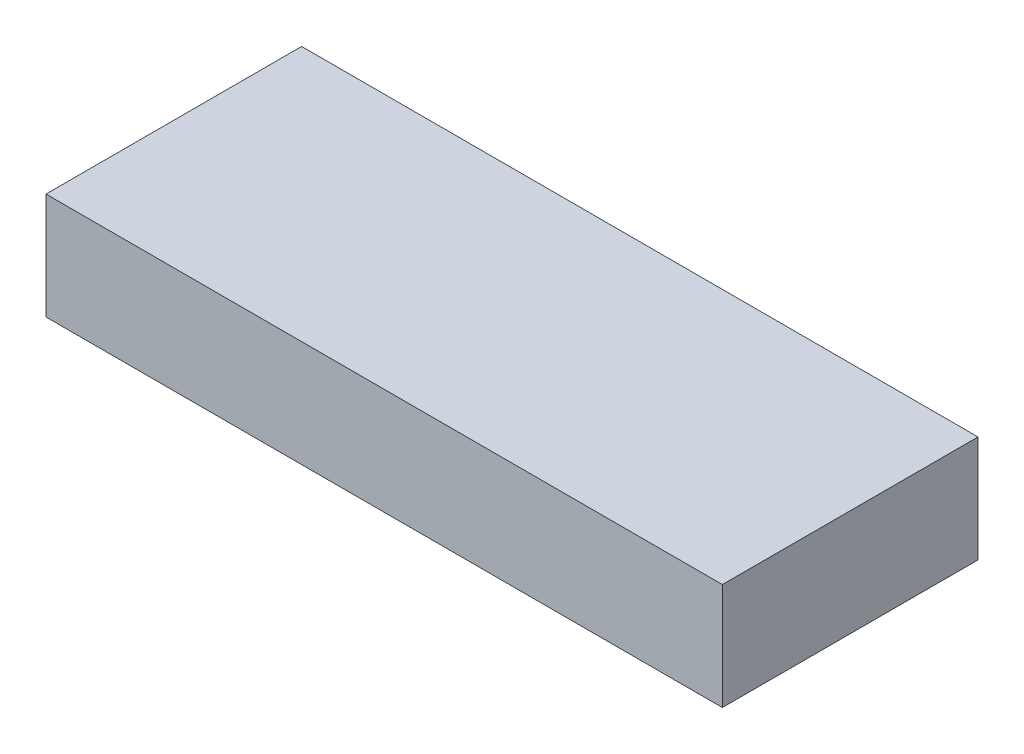
ISO-10303-21;
HEADER;
FILE_DESCRIPTION(('STEP AP214'),'2;1');
FILE_NAME('part.step','',(''),(''),'','','');
FILE_SCHEMA(('AUTOMOTIVE_DESIGN { 1 0 10303 214 1 1 1 1 }'));
ENDSEC;
DATA;
#1=APPLICATION_CONTEXT('core data for automotive mechanical design processes');
#2=APPLICATION_PROTOCOL_DEFINITION('international standard','automotive_design',2000,#1);
#3=PRODUCT_CONTEXT('',#1,'mechanical');
#4=PRODUCT('Part','Part','',(#3));
#5=PRODUCT_RELATED_PRODUCT_CATEGORY('part','',(#4));
#6=PRODUCT_DEFINITION_FORMATION('','',#4);
#7=PRODUCT_DEFINITION_CONTEXT('part definition',#1,'design');
#8=PRODUCT_DEFINITION('design','',#6,#7);
#9=PRODUCT_DEFINITION_SHAPE('','',#8);
#10=(LENGTH_UNIT() NAMED_UNIT(*) SI_UNIT(.MILLI.,.METRE.));
#11=(NAMED_UNIT(*) PLANE_ANGLE_UNIT() SI_UNIT($,.RADIAN.));
#12=(NAMED_UNIT(*) SI_UNIT($,.STERADIAN.) SOLID_ANGLE_UNIT());
#13=UNCERTAINTY_MEASURE_WITH_UNIT(LENGTH_MEASURE(1.E-05),#10,'distance_accuracy_value','');
#14=(GEOMETRIC_REPRESENTATION_CONTEXT(3) GLOBAL_UNCERTAINTY_ASSIGNED_CONTEXT((#13)) GLOBAL_UNIT_ASSIGNED_CONTEXT((#10,
#11,#12)) REPRESENTATION_CONTEXT('',''));
#15=CARTESIAN_POINT('',(0.,0.,0.));
#16=DIRECTION('',(0.,0.,1.));
#17=DIRECTION('',(1.,0.,0.));
#18=AXIS2_PLACEMENT_3D('',#15,#16,#17);
#19=CARTESIAN_POINT('',(0.,8.,0.));
#20=DIRECTION('',(1.,0.,0.));
#21=DIRECTION('',(0.,0.,-1.));
#22=AXIS2_PLACEMENT_3D('',#19,#20,#21);
#23=PLANE('',#22);
#24=DIRECTION('',(0.,0.,1.));
#25=VECTOR('',#24,1.);
#26=CARTESIAN_POINT('',(0.,0.,0.));
#27=LINE('',#26,#25);
#28=CARTESIAN_POINT('',(0.,0.,0.));
#29=VERTEX_POINT('',#28);
#30=CARTESIAN_POINT('',(0.,0.,19.2));
#31=VERTEX_POINT('',#30);
#32=EDGE_CURVE('E100',#29,#31,#27,.T.);
#33=ORIENTED_EDGE('',*,*,#32,.T.);
#34=DIRECTION('',(0.,-1.,0.));
#35=VECTOR('',#34,1.);
#36=CARTESIAN_POINT('',(0.,8.,19.2));
#37=LINE('',#36,#35);
#38=CARTESIAN_POINT('',(0.,8.,19.2));
#39=VERTEX_POINT('',#38);
#40=EDGE_CURVE('E11',#39,#31,#37,.T.);
#41=ORIENTED_EDGE('',*,*,#40,.F.);
#42=DIRECTION('',(0.,0.,1.));
#43=VECTOR('',#42,1.);
#44=CARTESIAN_POINT('',(0.,8.,0.));
#45=LINE('',#44,#43);
#46=CARTESIAN_POINT('',(0.,8.,0.));
#47=VERTEX_POINT('',#46);
#48=EDGE_CURVE('E88',#47,#39,#45,.T.);
#49=ORIENTED_EDGE('',*,*,#48,.F.);
#50=DIRECTION('',(0.,-1.,0.));
#51=VECTOR('',#50,1.);
#52=CARTESIAN_POINT('',(0.,8.,0.));
#53=LINE('',#52,#51);
#54=EDGE_CURVE('E96',#47,#29,#53,.T.);
#55=ORIENTED_EDGE('',*,*,#54,.T.);
#56=EDGE_LOOP('',(#33,#41,#49,#55));
#57=FACE_BOUND('',#56,.T.);
#58=ADVANCED_FACE('F37',(#57),#23,.F.);
#59=CARTESIAN_POINT('',(0.,8.,19.2));
#60=DIRECTION('',(0.,0.,-1.));
#61=DIRECTION('',(-1.,0.,0.));
#62=AXIS2_PLACEMENT_3D('',#59,#60,#61);
#63=PLANE('',#62);
#64=DIRECTION('',(1.,0.,0.));
#65=VECTOR('',#64,1.);
#66=CARTESIAN_POINT('',(0.,0.,19.2));
#67=LINE('',#66,#65);
#68=CARTESIAN_POINT('',(50.8,0.,19.2));
#69=VERTEX_POINT('',#68);
#70=EDGE_CURVE('E92',#31,#69,#67,.T.);
#71=ORIENTED_EDGE('',*,*,#70,.T.);
#72=DIRECTION('',(0.,-1.,0.));
#73=VECTOR('',#72,1.);
#74=CARTESIAN_POINT('',(50.8,8.,19.2));
#75=LINE('',#74,#73);
#76=CARTESIAN_POINT('',(50.8,8.,19.2));
#77=VERTEX_POINT('',#76);
#78=EDGE_CURVE('E45',#77,#69,#75,.T.);
#79=ORIENTED_EDGE('',*,*,#78,.F.);
#80=DIRECTION('',(1.,0.,0.));
#81=VECTOR('',#80,1.);
#82=CARTESIAN_POINT('',(0.,8.,19.2));
#83=LINE('',#82,#81);
#84=EDGE_CURVE('E83',#39,#77,#83,.T.);
#85=ORIENTED_EDGE('',*,*,#84,.F.);
#86=ORIENTED_EDGE('',*,*,#40,.T.);
#87=EDGE_LOOP('',(#71,#79,#85,#86));
#88=FACE_BOUND('',#87,.T.);
#89=ADVANCED_FACE('F91',(#88),#63,.F.);
#90=CARTESIAN_POINT('',(50.8,8.,0.));
#91=DIRECTION('',(-1.,0.,0.));
#92=DIRECTION('',(0.,0.,1.));
#93=AXIS2_PLACEMENT_3D('',#90,#91,#92);
#94=PLANE('',#93);
#95=DIRECTION('',(0.,0.,-1.));
#96=VECTOR('',#95,1.);
#97=CARTESIAN_POINT('',(50.8,0.,0.));
#98=LINE('',#97,#96);
#99=CARTESIAN_POINT('',(50.8,0.,0.));
#100=VERTEX_POINT('',#99);
#101=EDGE_CURVE('E70',#69,#100,#98,.T.);
#102=ORIENTED_EDGE('',*,*,#101,.T.);
#103=DIRECTION('',(0.,-1.,0.));
#104=VECTOR('',#103,1.);
#105=CARTESIAN_POINT('',(50.8,8.,0.));
#106=LINE('',#105,#104);
#107=CARTESIAN_POINT('',(50.8,8.,0.));
#108=VERTEX_POINT('',#107);
#109=EDGE_CURVE('E93',#108,#100,#106,.T.);
#110=ORIENTED_EDGE('',*,*,#109,.F.);
#111=DIRECTION('',(0.,0.,-1.));
#112=VECTOR('',#111,1.);
#113=CARTESIAN_POINT('',(50.8,8.,0.));
#114=LINE('',#113,#112);
#115=EDGE_CURVE('E86',#77,#108,#114,.T.);
#116=ORIENTED_EDGE('',*,*,#115,.F.);
#117=ORIENTED_EDGE('',*,*,#78,.T.);
#118=EDGE_LOOP('',(#102,#110,#116,#117));
#119=FACE_BOUND('',#118,.T.);
#120=ADVANCED_FACE('F94',(#119),#94,.F.);
#121=CARTESIAN_POINT('',(0.,8.,0.));
#122=DIRECTION('',(0.,0.,1.));
#123=DIRECTION('',(1.,0.,0.));
#124=AXIS2_PLACEMENT_3D('',#121,#122,#123);
#125=PLANE('',#124);
#126=DIRECTION('',(-1.,0.,0.));
#127=VECTOR('',#126,1.);
#128=CARTESIAN_POINT('',(0.,0.,0.));
#129=LINE('',#128,#127);
#130=EDGE_CURVE('E76',#100,#29,#129,.T.);
#131=ORIENTED_EDGE('',*,*,#130,.T.);
#132=ORIENTED_EDGE('',*,*,#54,.F.);
#133=DIRECTION('',(-1.,0.,0.));
#134=VECTOR('',#133,1.);
#135=CARTESIAN_POINT('',(0.,8.,0.));
#136=LINE('',#135,#134);
#137=EDGE_CURVE('E53',#108,#47,#136,.T.);
#138=ORIENTED_EDGE('',*,*,#137,.F.);
#139=ORIENTED_EDGE('',*,*,#109,.T.);
#140=EDGE_LOOP('',(#131,#132,#138,#139));
#141=FACE_BOUND('',#140,.T.);
#142=ADVANCED_FACE('F107',(#141),#125,.F.);
#143=CARTESIAN_POINT('',(0.,8.,0.));
#144=DIRECTION('',(0.,1.,0.));
#145=DIRECTION('',(0.,0.,1.));
#146=AXIS2_PLACEMENT_3D('',#143,#144,#145);
#147=PLANE('',#146);
#148=ORIENTED_EDGE('',*,*,#48,.T.);
#149=ORIENTED_EDGE('',*,*,#84,.T.);
#150=ORIENTED_EDGE('',*,*,#115,.T.);
#151=ORIENTED_EDGE('',*,*,#137,.T.);
#152=EDGE_LOOP('',(#148,#149,#150,#151));
#153=FACE_BOUND('',#152,.T.);
#154=ADVANCED_FACE('F84',(#153),#147,.T.);
#155=CARTESIAN_POINT('',(0.,0.,0.));
#156=DIRECTION('',(0.,1.,0.));
#157=DIRECTION('',(0.,0.,1.));
#158=AXIS2_PLACEMENT_3D('',#155,#156,#157);
#159=PLANE('',#158);
#160=ORIENTED_EDGE('',*,*,#32,.F.);
#161=ORIENTED_EDGE('',*,*,#130,.F.);
#162=ORIENTED_EDGE('',*,*,#101,.F.);
#163=ORIENTED_EDGE('',*,*,#70,.F.);
#164=EDGE_LOOP('',(#160,#161,#162,#163));
#165=FACE_BOUND('',#164,.T.);
#166=ADVANCED_FACE('F110',(#165),#159,.F.);
#167=CLOSED_SHELL('',(#58,#89,#120,#142,#154,#166));
#168=MANIFOLD_SOLID_BREP('B2',#167);
#169=ADVANCED_BREP_SHAPE_REPRESENTATION('',(#18,#168),#14);
#170=SHAPE_DEFINITION_REPRESENTATION(#9,#169);
ENDSEC;
END-ISO-10303-21;
